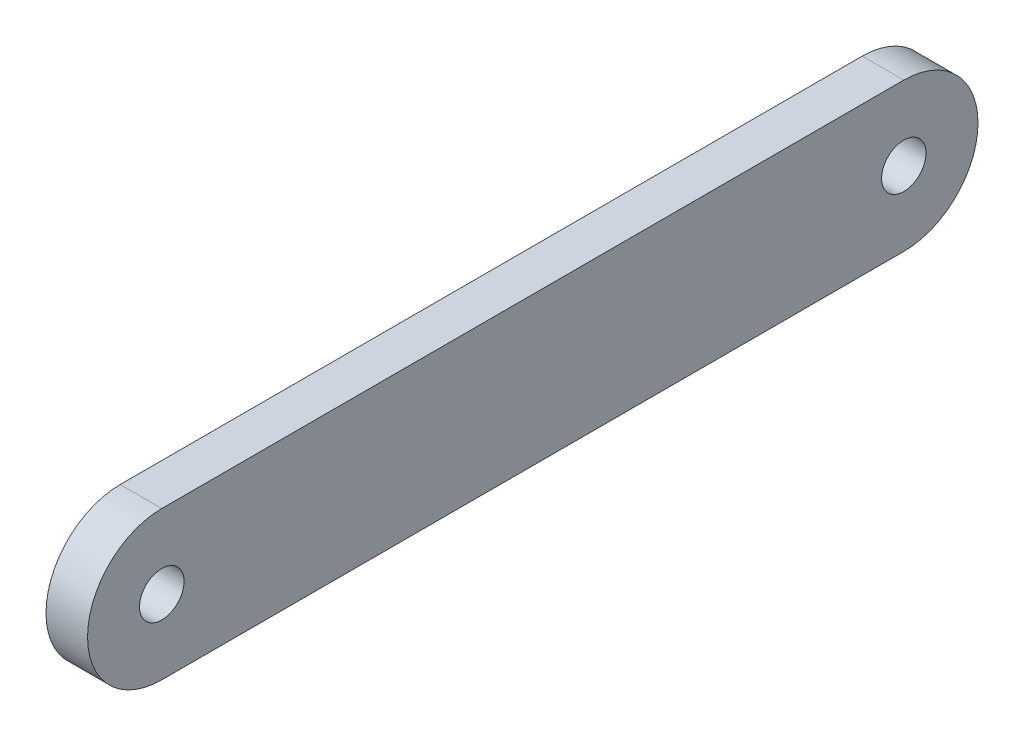
ISO-10303-21;
HEADER;
FILE_DESCRIPTION(('STEP AP214'),'2;1');
FILE_NAME('part.step','',(''),(''),'','','');
FILE_SCHEMA(('AUTOMOTIVE_DESIGN { 1 0 10303 214 1 1 1 1 }'));
ENDSEC;
DATA;
#1=APPLICATION_CONTEXT('core data for automotive mechanical design processes');
#2=APPLICATION_PROTOCOL_DEFINITION('international standard','automotive_design',2000,#1);
#3=PRODUCT_CONTEXT('',#1,'mechanical');
#4=PRODUCT('Part','Part','',(#3));
#5=PRODUCT_RELATED_PRODUCT_CATEGORY('part','',(#4));
#6=PRODUCT_DEFINITION_FORMATION('','',#4);
#7=PRODUCT_DEFINITION_CONTEXT('part definition',#1,'design');
#8=PRODUCT_DEFINITION('design','',#6,#7);
#9=PRODUCT_DEFINITION_SHAPE('','',#8);
#10=(LENGTH_UNIT() NAMED_UNIT(*) SI_UNIT(.MILLI.,.METRE.));
#11=(NAMED_UNIT(*) PLANE_ANGLE_UNIT() SI_UNIT($,.RADIAN.));
#12=(NAMED_UNIT(*) SI_UNIT($,.STERADIAN.) SOLID_ANGLE_UNIT());
#13=UNCERTAINTY_MEASURE_WITH_UNIT(LENGTH_MEASURE(1.E-05),#10,'distance_accuracy_value','');
#14=(GEOMETRIC_REPRESENTATION_CONTEXT(3) GLOBAL_UNCERTAINTY_ASSIGNED_CONTEXT((#13)) GLOBAL_UNIT_ASSIGNED_CONTEXT((#10,
#11,#12)) REPRESENTATION_CONTEXT('',''));
#15=CARTESIAN_POINT('',(0.,0.,0.));
#16=DIRECTION('',(0.,0.,1.));
#17=DIRECTION('',(1.,0.,0.));
#18=AXIS2_PLACEMENT_3D('',#15,#16,#17);
#19=CARTESIAN_POINT('',(28.,0.,250.));
#20=DIRECTION('',(1.,0.,0.));
#21=DIRECTION('',(0.,0.,-1.));
#22=AXIS2_PLACEMENT_3D('',#19,#20,#21);
#23=PLANE('',#22);
#24=CARTESIAN_POINT('',(28.,0.,-250.));
#25=DIRECTION('',(1.,0.,0.));
#26=DIRECTION('',(0.,0.,-1.));
#27=AXIS2_PLACEMENT_3D('',#24,#25,#26);
#28=CIRCLE('',#27,15.);
#29=CARTESIAN_POINT('',(28.,0.,-265.));
#30=VERTEX_POINT('',#29);
#31=EDGE_CURVE('E105',#30,#30,#28,.T.);
#32=ORIENTED_EDGE('',*,*,#31,.F.);
#33=EDGE_LOOP('',(#32));
#34=FACE_BOUND('',#33,.T.);
#35=CARTESIAN_POINT('',(28.,0.,250.));
#36=DIRECTION('',(1.,0.,0.));
#37=DIRECTION('',(0.,0.,-1.));
#38=AXIS2_PLACEMENT_3D('',#35,#36,#37);
#39=CIRCLE('',#38,50.);
#40=CARTESIAN_POINT('',(28.,50.,250.));
#41=VERTEX_POINT('',#40);
#42=CARTESIAN_POINT('',(28.,-50.,250.));
#43=VERTEX_POINT('',#42);
#44=EDGE_CURVE('E90',#41,#43,#39,.T.);
#45=ORIENTED_EDGE('',*,*,#44,.T.);
#46=DIRECTION('',(0.,0.,-1.));
#47=VECTOR('',#46,1.);
#48=CARTESIAN_POINT('',(28.,-50.,250.));
#49=LINE('',#48,#47);
#50=CARTESIAN_POINT('',(28.,-50.,-250.));
#51=VERTEX_POINT('',#50);
#52=EDGE_CURVE('E85',#43,#51,#49,.T.);
#53=ORIENTED_EDGE('',*,*,#52,.T.);
#54=CARTESIAN_POINT('',(28.,0.,-250.));
#55=DIRECTION('',(1.,0.,0.));
#56=DIRECTION('',(0.,0.,-1.));
#57=AXIS2_PLACEMENT_3D('',#54,#55,#56);
#58=CIRCLE('',#57,50.);
#59=CARTESIAN_POINT('',(28.,50.,-250.));
#60=VERTEX_POINT('',#59);
#61=EDGE_CURVE('E88',#51,#60,#58,.T.);
#62=ORIENTED_EDGE('',*,*,#61,.T.);
#63=DIRECTION('',(0.,0.,1.));
#64=VECTOR('',#63,1.);
#65=CARTESIAN_POINT('',(28.,50.,250.));
#66=LINE('',#65,#64);
#67=EDGE_CURVE('E55',#60,#41,#66,.T.);
#68=ORIENTED_EDGE('',*,*,#67,.T.);
#69=EDGE_LOOP('',(#45,#53,#62,#68));
#70=FACE_BOUND('',#69,.T.);
#71=CARTESIAN_POINT('',(28.,0.,250.));
#72=DIRECTION('',(1.,0.,0.));
#73=DIRECTION('',(0.,0.,-1.));
#74=AXIS2_PLACEMENT_3D('',#71,#72,#73);
#75=CIRCLE('',#74,15.);
#76=CARTESIAN_POINT('',(28.,0.,235.));
#77=VERTEX_POINT('',#76);
#78=EDGE_CURVE('E120',#77,#77,#75,.T.);
#79=ORIENTED_EDGE('',*,*,#78,.F.);
#80=EDGE_LOOP('',(#79));
#81=FACE_BOUND('',#80,.T.);
#82=ADVANCED_FACE('F38',(#34,#70,#81),#23,.T.);
#83=CARTESIAN_POINT('',(0.,0.,250.));
#84=DIRECTION('',(1.,0.,0.));
#85=DIRECTION('',(0.,0.,-1.));
#86=AXIS2_PLACEMENT_3D('',#83,#84,#85);
#87=PLANE('',#86);
#88=CARTESIAN_POINT('',(0.,0.,250.));
#89=DIRECTION('',(1.,0.,0.));
#90=DIRECTION('',(0.,0.,-1.));
#91=AXIS2_PLACEMENT_3D('',#88,#89,#90);
#92=CIRCLE('',#91,50.);
#93=CARTESIAN_POINT('',(0.,50.,250.));
#94=VERTEX_POINT('',#93);
#95=CARTESIAN_POINT('',(0.,-50.,250.));
#96=VERTEX_POINT('',#95);
#97=EDGE_CURVE('E102',#94,#96,#92,.T.);
#98=ORIENTED_EDGE('',*,*,#97,.F.);
#99=DIRECTION('',(0.,0.,1.));
#100=VECTOR('',#99,1.);
#101=CARTESIAN_POINT('',(0.,50.,250.));
#102=LINE('',#101,#100);
#103=CARTESIAN_POINT('',(0.,50.,-250.));
#104=VERTEX_POINT('',#103);
#105=EDGE_CURVE('E78',#104,#94,#102,.T.);
#106=ORIENTED_EDGE('',*,*,#105,.F.);
#107=CARTESIAN_POINT('',(0.,0.,-250.));
#108=DIRECTION('',(1.,0.,0.));
#109=DIRECTION('',(0.,0.,-1.));
#110=AXIS2_PLACEMENT_3D('',#107,#108,#109);
#111=CIRCLE('',#110,50.);
#112=CARTESIAN_POINT('',(0.,-50.,-250.));
#113=VERTEX_POINT('',#112);
#114=EDGE_CURVE('E72',#113,#104,#111,.T.);
#115=ORIENTED_EDGE('',*,*,#114,.F.);
#116=DIRECTION('',(0.,0.,-1.));
#117=VECTOR('',#116,1.);
#118=CARTESIAN_POINT('',(0.,-50.,250.));
#119=LINE('',#118,#117);
#120=EDGE_CURVE('E94',#96,#113,#119,.T.);
#121=ORIENTED_EDGE('',*,*,#120,.F.);
#122=EDGE_LOOP('',(#98,#106,#115,#121));
#123=FACE_BOUND('',#122,.T.);
#124=CARTESIAN_POINT('',(0.,0.,-250.));
#125=DIRECTION('',(1.,0.,0.));
#126=DIRECTION('',(0.,0.,-1.));
#127=AXIS2_PLACEMENT_3D('',#124,#125,#126);
#128=CIRCLE('',#127,15.);
#129=CARTESIAN_POINT('',(0.,0.,-265.));
#130=VERTEX_POINT('',#129);
#131=EDGE_CURVE('E117',#130,#130,#128,.T.);
#132=ORIENTED_EDGE('',*,*,#131,.T.);
#133=EDGE_LOOP('',(#132));
#134=FACE_BOUND('',#133,.T.);
#135=CARTESIAN_POINT('',(0.,0.,250.));
#136=DIRECTION('',(1.,0.,0.));
#137=DIRECTION('',(0.,0.,-1.));
#138=AXIS2_PLACEMENT_3D('',#135,#136,#137);
#139=CIRCLE('',#138,15.);
#140=CARTESIAN_POINT('',(0.,0.,235.));
#141=VERTEX_POINT('',#140);
#142=EDGE_CURVE('E123',#141,#141,#139,.T.);
#143=ORIENTED_EDGE('',*,*,#142,.T.);
#144=EDGE_LOOP('',(#143));
#145=FACE_BOUND('',#144,.T.);
#146=ADVANCED_FACE('F113',(#123,#134,#145),#87,.F.);
#147=CARTESIAN_POINT('',(28.,0.,250.));
#148=DIRECTION('',(-1.,0.,0.));
#149=DIRECTION('',(0.,0.,1.));
#150=AXIS2_PLACEMENT_3D('',#147,#148,#149);
#151=CYLINDRICAL_SURFACE('',#150,50.);
#152=ORIENTED_EDGE('',*,*,#97,.T.);
#153=DIRECTION('',(-1.,0.,0.));
#154=VECTOR('',#153,1.);
#155=CARTESIAN_POINT('',(28.,-50.,250.));
#156=LINE('',#155,#154);
#157=EDGE_CURVE('E11',#43,#96,#156,.T.);
#158=ORIENTED_EDGE('',*,*,#157,.F.);
#159=ORIENTED_EDGE('',*,*,#44,.F.);
#160=DIRECTION('',(-1.,0.,0.));
#161=VECTOR('',#160,1.);
#162=CARTESIAN_POINT('',(28.,50.,250.));
#163=LINE('',#162,#161);
#164=EDGE_CURVE('E98',#41,#94,#163,.T.);
#165=ORIENTED_EDGE('',*,*,#164,.T.);
#166=EDGE_LOOP('',(#152,#158,#159,#165));
#167=FACE_BOUND('',#166,.T.);
#168=ADVANCED_FACE('F40',(#167),#151,.T.);
#169=CARTESIAN_POINT('',(28.,-50.,250.));
#170=DIRECTION('',(0.,1.,0.));
#171=DIRECTION('',(0.,0.,1.));
#172=AXIS2_PLACEMENT_3D('',#169,#170,#171);
#173=PLANE('',#172);
#174=ORIENTED_EDGE('',*,*,#120,.T.);
#175=DIRECTION('',(-1.,0.,0.));
#176=VECTOR('',#175,1.);
#177=CARTESIAN_POINT('',(28.,-50.,-250.));
#178=LINE('',#177,#176);
#179=EDGE_CURVE('E47',#51,#113,#178,.T.);
#180=ORIENTED_EDGE('',*,*,#179,.F.);
#181=ORIENTED_EDGE('',*,*,#52,.F.);
#182=ORIENTED_EDGE('',*,*,#157,.T.);
#183=EDGE_LOOP('',(#174,#180,#181,#182));
#184=FACE_BOUND('',#183,.T.);
#185=ADVANCED_FACE('F93',(#184),#173,.F.);
#186=CARTESIAN_POINT('',(28.,0.,-250.));
#187=DIRECTION('',(-1.,0.,0.));
#188=DIRECTION('',(0.,0.,1.));
#189=AXIS2_PLACEMENT_3D('',#186,#187,#188);
#190=CYLINDRICAL_SURFACE('',#189,50.);
#191=ORIENTED_EDGE('',*,*,#114,.T.);
#192=DIRECTION('',(-1.,0.,0.));
#193=VECTOR('',#192,1.);
#194=CARTESIAN_POINT('',(28.,50.,-250.));
#195=LINE('',#194,#193);
#196=EDGE_CURVE('E95',#60,#104,#195,.T.);
#197=ORIENTED_EDGE('',*,*,#196,.F.);
#198=ORIENTED_EDGE('',*,*,#61,.F.);
#199=ORIENTED_EDGE('',*,*,#179,.T.);
#200=EDGE_LOOP('',(#191,#197,#198,#199));
#201=FACE_BOUND('',#200,.T.);
#202=ADVANCED_FACE('F96',(#201),#190,.T.);
#203=CARTESIAN_POINT('',(28.,50.,250.));
#204=DIRECTION('',(0.,-1.,0.));
#205=DIRECTION('',(0.,0.,-1.));
#206=AXIS2_PLACEMENT_3D('',#203,#204,#205);
#207=PLANE('',#206);
#208=ORIENTED_EDGE('',*,*,#105,.T.);
#209=ORIENTED_EDGE('',*,*,#164,.F.);
#210=ORIENTED_EDGE('',*,*,#67,.F.);
#211=ORIENTED_EDGE('',*,*,#196,.T.);
#212=EDGE_LOOP('',(#208,#209,#210,#211));
#213=FACE_BOUND('',#212,.T.);
#214=ADVANCED_FACE('F110',(#213),#207,.F.);
#215=CARTESIAN_POINT('',(28.,0.,-250.));
#216=DIRECTION('',(-1.,0.,0.));
#217=DIRECTION('',(0.,0.,1.));
#218=AXIS2_PLACEMENT_3D('',#215,#216,#217);
#219=CYLINDRICAL_SURFACE('',#218,15.);
#220=ORIENTED_EDGE('',*,*,#31,.T.);
#221=EDGE_LOOP('',(#220));
#222=FACE_BOUND('',#221,.T.);
#223=ORIENTED_EDGE('',*,*,#131,.F.);
#224=EDGE_LOOP('',(#223));
#225=FACE_BOUND('',#224,.T.);
#226=ADVANCED_FACE('F140',(#222,#225),#219,.F.);
#227=CARTESIAN_POINT('',(28.,0.,250.));
#228=DIRECTION('',(-1.,0.,0.));
#229=DIRECTION('',(0.,0.,1.));
#230=AXIS2_PLACEMENT_3D('',#227,#228,#229);
#231=CYLINDRICAL_SURFACE('',#230,15.);
#232=ORIENTED_EDGE('',*,*,#78,.T.);
#233=EDGE_LOOP('',(#232));
#234=FACE_BOUND('',#233,.T.);
#235=ORIENTED_EDGE('',*,*,#142,.F.);
#236=EDGE_LOOP('',(#235));
#237=FACE_BOUND('',#236,.T.);
#238=ADVANCED_FACE('F129',(#234,#237),#231,.F.);
#239=CLOSED_SHELL('',(#82,#146,#168,#185,#202,#214,#226,#238));
#240=MANIFOLD_SOLID_BREP('B2',#239);
#241=ADVANCED_BREP_SHAPE_REPRESENTATION('',(#18,#240),#14);
#242=SHAPE_DEFINITION_REPRESENTATION(#9,#241);
ENDSEC;
END-ISO-10303-21;
